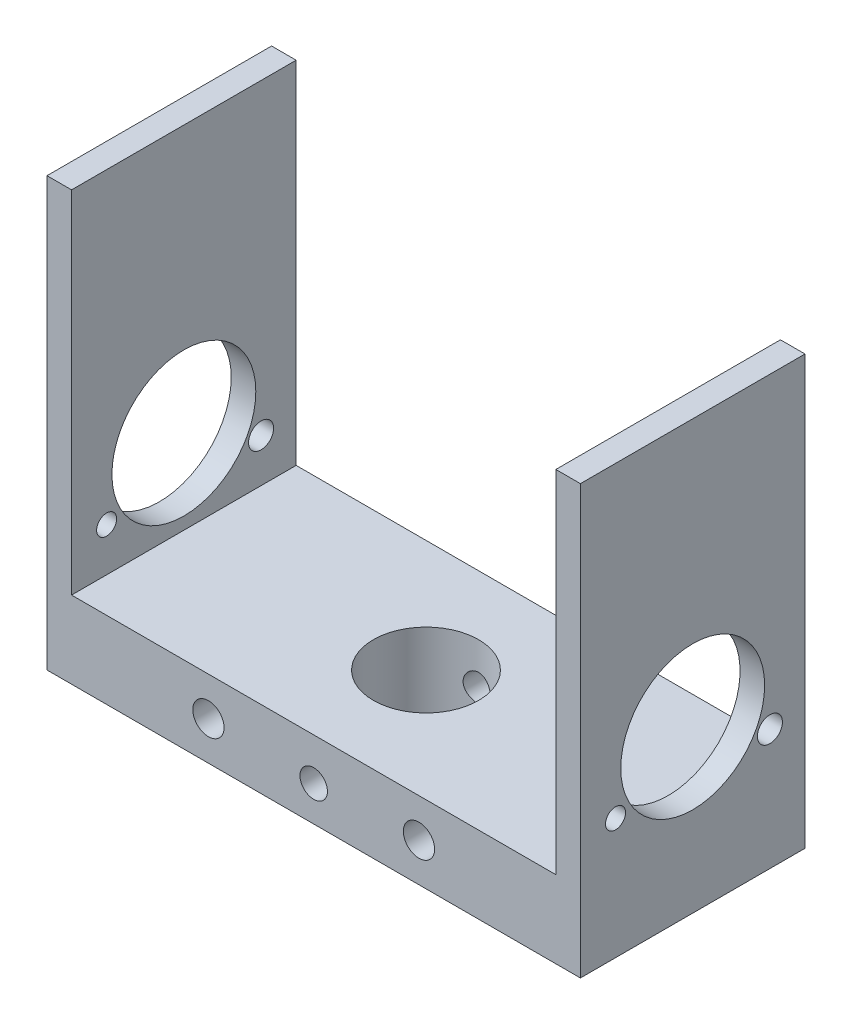
ISO-10303-21;
HEADER;
FILE_DESCRIPTION(('STEP AP214'),'2;1');
FILE_NAME('part.step','',(''),(''),'','','');
FILE_SCHEMA(('AUTOMOTIVE_DESIGN { 1 0 10303 214 1 1 1 1 }'));
ENDSEC;
DATA;
#1=APPLICATION_CONTEXT('core data for automotive mechanical design processes');
#2=APPLICATION_PROTOCOL_DEFINITION('international standard','automotive_design',2000,#1);
#3=PRODUCT_CONTEXT('',#1,'mechanical');
#4=PRODUCT('Part','Part','',(#3));
#5=PRODUCT_RELATED_PRODUCT_CATEGORY('part','',(#4));
#6=PRODUCT_DEFINITION_FORMATION('','',#4);
#7=PRODUCT_DEFINITION_CONTEXT('part definition',#1,'design');
#8=PRODUCT_DEFINITION('design','',#6,#7);
#9=PRODUCT_DEFINITION_SHAPE('','',#8);
#10=(LENGTH_UNIT() NAMED_UNIT(*) SI_UNIT(.MILLI.,.METRE.));
#11=(NAMED_UNIT(*) PLANE_ANGLE_UNIT() SI_UNIT($,.RADIAN.));
#12=(NAMED_UNIT(*) SI_UNIT($,.STERADIAN.) SOLID_ANGLE_UNIT());
#13=UNCERTAINTY_MEASURE_WITH_UNIT(LENGTH_MEASURE(1.E-05),#10,'distance_accuracy_value','');
#14=(GEOMETRIC_REPRESENTATION_CONTEXT(3) GLOBAL_UNCERTAINTY_ASSIGNED_CONTEXT((#13)) GLOBAL_UNIT_ASSIGNED_CONTEXT((#10,
#11,#12)) REPRESENTATION_CONTEXT('',''));
#15=CARTESIAN_POINT('',(0.,0.,0.));
#16=DIRECTION('',(0.,0.,1.));
#17=DIRECTION('',(1.,0.,0.));
#18=AXIS2_PLACEMENT_3D('',#15,#16,#17);
#19=CARTESIAN_POINT('',(0.,11.,0.));
#20=DIRECTION('',(0.,-1.,0.));
#21=DIRECTION('',(0.,0.,-1.));
#22=AXIS2_PLACEMENT_3D('',#19,#20,#21);
#23=CYLINDRICAL_SURFACE('',#22,7.5);
#24=CARTESIAN_POINT('',(0.,6.95657881978151,-7.5));
#25=CARTESIAN_POINT('',(-0.107946364564902,6.95657608479232,-7.49999829409718));
#26=CARTESIAN_POINT('',(-0.215922460247262,6.9476155726121,-7.49764648086753));
#27=CARTESIAN_POINT('',(-0.428769781257654,6.91207024837906,-7.48849284636282));
#28=CARTESIAN_POINT('',(-0.533639389937558,6.88547642243373,-7.48168874916857));
#29=CARTESIAN_POINT('',(-0.737170149926897,6.81558367474133,-7.46438241061037));
#30=CARTESIAN_POINT('',(-0.83583893180239,6.77230577141053,-7.45388482371132));
#31=CARTESIAN_POINT('',(-1.02451713461076,6.67034989228236,-7.43030394518545));
#32=CARTESIAN_POINT('',(-1.11452607759247,6.6116710671476,-7.41722051096291));
#33=CARTESIAN_POINT('',(-1.2853343315649,6.47919892245098,-7.38955744104232));
#34=CARTESIAN_POINT('',(-1.36591327821114,6.40512661698847,-7.37495310192332));
#35=CARTESIAN_POINT('',(-1.51365738047839,6.24456686229889,-7.34605477210242));
#36=CARTESIAN_POINT('',(-1.58082088664746,6.15807788866486,-7.33176081975545));
#37=CARTESIAN_POINT('',(-1.70088852195455,5.97339792459517,-7.30485028951631));
#38=CARTESIAN_POINT('',(-1.75354162313657,5.87503876286007,-7.29226494903625));
#39=CARTESIAN_POINT('',(-1.84147785560564,5.6704830459492,-7.27055877998523));
#40=CARTESIAN_POINT('',(-1.87676403752897,5.56428787100226,-7.26143734301666));
#41=CARTESIAN_POINT('',(-1.92820426186949,5.34950906386497,-7.24794638867982));
#42=CARTESIAN_POINT('',(-1.94475667734311,5.24102719650644,-7.24347809401741));
#43=CARTESIAN_POINT('',(-1.95950110574343,5.02274140821986,-7.23950402851081));
#44=CARTESIAN_POINT('',(-1.95769639064206,4.91293772637659,-7.23999737330463));
#45=CARTESIAN_POINT('',(-1.93609461211739,4.69821456169404,-7.24580230007284));
#46=CARTESIAN_POINT('',(-1.91677697065728,4.59324282802915,-7.25098548877502));
#47=CARTESIAN_POINT('',(-1.86146446333956,4.38808432021206,-7.26538085026939));
#48=CARTESIAN_POINT('',(-1.82546831572267,4.28789791446981,-7.27459333271366));
#49=CARTESIAN_POINT('',(-1.73742363128245,4.09389163729188,-7.29612391025943));
#50=CARTESIAN_POINT('',(-1.6852049322767,4.0001527663405,-7.30847466075432));
#51=CARTESIAN_POINT('',(-1.56631625419894,3.8225983531511,-7.33487229182484));
#52=CARTESIAN_POINT('',(-1.49964354138536,3.73878469274828,-7.3489194930336));
#53=CARTESIAN_POINT('',(-1.35127675636788,3.58071776395202,-7.37766388694415));
#54=CARTESIAN_POINT('',(-1.26917938027748,3.50684374037711,-7.39236769485393));
#55=CARTESIAN_POINT('',(-1.09358279011063,3.3738361993755,-7.42037529647513));
#56=CARTESIAN_POINT('',(-1.00008316422827,3.31470321457402,-7.43367903958919));
#57=CARTESIAN_POINT('',(-0.803765272671003,3.21269924222162,-7.45746365900913));
#58=CARTESIAN_POINT('',(-0.700911155681178,3.16989439085628,-7.46793300612001));
#59=CARTESIAN_POINT('',(-0.489131848650789,3.1022911874673,-7.48478573185381));
#60=CARTESIAN_POINT('',(-0.380207931582816,3.07748907505675,-7.49116996373687));
#61=CARTESIAN_POINT('',(-0.162619612573132,3.04718507907007,-7.49900506988132));
#62=CARTESIAN_POINT('',(-0.0540317016819167,3.04116728875273,-7.50058778155143));
#63=CARTESIAN_POINT('',(0.162600978971437,3.04718147109928,-7.4990193037233));
#64=CARTESIAN_POINT('',(0.270645801233394,3.05921166405311,-7.49586858098859));
#65=CARTESIAN_POINT('',(0.481301170897615,3.10055638216674,-7.48527217694353));
#66=CARTESIAN_POINT('',(0.583971654548013,3.12958538362453,-7.47789748805037));
#67=CARTESIAN_POINT('',(0.782977392824017,3.20377405385957,-7.45968766837723));
#68=CARTESIAN_POINT('',(0.879311975262717,3.24893543089064,-7.44885217114585));
#69=CARTESIAN_POINT('',(1.06493298841419,3.35507895472866,-7.42461127694485));
#70=CARTESIAN_POINT('',(1.15405125163689,3.41634470209864,-7.4111610692043));
#71=CARTESIAN_POINT('',(1.32092387228479,3.55259923612709,-7.38324659525931));
#72=CARTESIAN_POINT('',(1.39867608025108,3.62759061244527,-7.36878213801131));
#73=CARTESIAN_POINT('',(1.5427666331707,3.79157120626935,-7.33998800539096));
#74=CARTESIAN_POINT('',(1.60874168302897,3.88088270113256,-7.32567242227141));
#75=CARTESIAN_POINT('',(1.7247729672489,4.06960936068848,-7.29922689640339));
#76=CARTESIAN_POINT('',(1.77482988555097,4.16902409104207,-7.28709685976016));
#77=CARTESIAN_POINT('',(1.85722734966055,4.37462312714089,-7.26653362065818));
#78=CARTESIAN_POINT('',(1.88967176163885,4.48076352943255,-7.2580788045976));
#79=CARTESIAN_POINT('',(1.93617987745534,4.69724988253897,-7.24581237283704));
#80=CARTESIAN_POINT('',(1.95024803453631,4.80759480776971,-7.24199963220658));
#81=CARTESIAN_POINT('',(1.95935631656429,5.02564665644383,-7.23954013519883));
#82=CARTESIAN_POINT('',(1.95497916242649,5.13332782737795,-7.24073516740981));
#83=CARTESIAN_POINT('',(1.92866638884747,5.34635951265062,-7.24778778271667));
#84=CARTESIAN_POINT('',(1.90673118503415,5.45171008209767,-7.25364525544491));
#85=CARTESIAN_POINT('',(1.84625602033183,5.65639201972108,-7.26927067907943));
#86=CARTESIAN_POINT('',(1.8078345194924,5.75576066914006,-7.27901069767724));
#87=CARTESIAN_POINT('',(1.71556987778395,5.94671522396255,-7.30130553554317));
#88=CARTESIAN_POINT('',(1.66172441447788,6.03829995462069,-7.31386077864708));
#89=CARTESIAN_POINT('',(1.53835279067282,6.21388065722421,-7.34081452826713));
#90=CARTESIAN_POINT('',(1.46842659689182,6.29758913051163,-7.35525508940553));
#91=CARTESIAN_POINT('',(1.31564591249168,6.45227322525811,-7.38411193422154));
#92=CARTESIAN_POINT('',(1.23278831076941,6.52324577378778,-7.39852821121091));
#93=CARTESIAN_POINT('',(1.05447630015724,6.65184920198947,-7.42606026321141));
#94=CARTESIAN_POINT('',(0.958801184743865,6.70918151474524,-7.43914387340147));
#95=CARTESIAN_POINT('',(0.758834470912768,6.80685751890578,-7.46218921477443));
#96=CARTESIAN_POINT('',(0.654548688398568,6.84721256677893,-7.47215303171156));
#97=CARTESIAN_POINT('',(0.4588138485334,6.90426587808921,-7.48648184499085));
#98=CARTESIAN_POINT('',(0.36824102917206,6.92383880503031,-7.49151497124519));
#99=CARTESIAN_POINT('',(0.185119309122388,6.94999586469676,-7.49827463156544));
#100=CARTESIAN_POINT('',(0.0925705868533558,6.95658116520143,-7.50000146291564));
#101=CARTESIAN_POINT('',(0.,6.95657881978151,-7.5));
#102=B_SPLINE_CURVE_WITH_KNOTS('',3,(#24,#25,#26,#27,#28,#29,#30,#31,#32,#33,#34,#35,#36,#37,
#38,#39,#40,#41,#42,#43,#44,#45,#46,#47,#48,#49,#50,#51,#52,#53,#54,#55,#56,#57,#58,#59,#60,#61,
#62,#63,#64,#65,#66,#67,#68,#69,#70,#71,#72,#73,#74,#75,#76,#77,#78,#79,#80,#81,#82,#83,#84,#85,
#86,#87,#88,#89,#90,#91,#92,#93,#94,#95,#96,#97,#98,#99,#100,#101),.UNSPECIFIED.,.T.,.F.,(4,2,2,
2,2,2,2,2,2,2,2,2,2,2,2,2,2,2,2,2,2,2,2,2,2,2,2,2,2,2,2,2,2,2,2,2,2,2,4),(0.,0.32349970030434,
0.647164896553866,0.970423668447146,1.29370027131695,1.62344664876618,1.9532335441881,
2.28841110907767,2.62352977635381,2.9513797663814,3.27917132150473,3.59825180225162,
3.9173568087096,4.23992893818654,4.56256213024292,4.89524779778665,5.22794548423242,
5.56197678570706,5.89593829509701,6.22064309380061,6.54531587549663,6.86468560314075,
7.18408915880735,7.50954574099367,7.83506379156495,8.16933827570965,8.50359839543439,
8.8358652569697,9.16805158306996,9.48982352718205,9.81158785464847,10.1310779172683,
10.4506161118741,10.7791819085228,11.1078268753861,11.4431126109362,11.7781737084425,
12.0556193660821,12.3330400761242),.UNSPECIFIED.);
#103=CARTESIAN_POINT('',(0.,6.95657881978151,-7.5));
#104=VERTEX_POINT('',#103);
#105=EDGE_CURVE('E231',#104,#104,#102,.T.);
#106=ORIENTED_EDGE('',*,*,#105,.F.);
#107=EDGE_LOOP('',(#106));
#108=FACE_BOUND('',#107,.T.);
#109=CARTESIAN_POINT('',(1.95657881978151,5.,7.24029000261608));
#110=CARTESIAN_POINT('',(1.9565760467599,4.89212413071801,7.24029195002129));
#111=CARTESIAN_POINT('',(1.94762683085069,4.78421845460437,7.24272727499572));
#112=CARTESIAN_POINT('',(1.91213043552985,4.57151718314405,7.25217782412518));
#113=CARTESIAN_POINT('',(1.88557393036292,4.46672326669808,7.25919547529363));
#114=CARTESIAN_POINT('',(1.81579023358658,4.26335309083301,7.27696300468709));
#115=CARTESIAN_POINT('',(1.77258579947214,4.1647685563857,7.28770778598318));
#116=CARTESIAN_POINT('',(1.67080327315547,3.97623321682641,7.31171246602871));
#117=CARTESIAN_POINT('',(1.61222417628182,3.88628297645509,7.32497252912585));
#118=CARTESIAN_POINT('',(1.47985579460554,3.71541565210849,7.35286937756008));
#119=CARTESIAN_POINT('',(1.40576506142926,3.63473589503927,7.36752972863036));
#120=CARTESIAN_POINT('',(1.24512523624676,3.4867951817206,7.39637153864115));
#121=CARTESIAN_POINT('',(1.15857490008447,3.41953556714432,7.41055294958221));
#122=CARTESIAN_POINT('',(0.973834063729922,3.2993613554589,7.43710119473916));
#123=CARTESIAN_POINT('',(0.875485878480729,3.24668171037913,7.44943698342588));
#124=CARTESIAN_POINT('',(0.670953593091338,3.15869345877179,7.47063422849569));
#125=CARTESIAN_POINT('',(0.56477075863742,3.12338205344322,7.47949624461231));
#126=CARTESIAN_POINT('',(0.350059462872555,3.07189793094571,7.49258081685298));
#127=CARTESIAN_POINT('',(0.241633801783191,3.05532174488583,7.49690103309964));
#128=CARTESIAN_POINT('',(0.0234602745278105,3.04051024591311,7.50075628840478));
#129=CARTESIAN_POINT('',(-0.0862873766617317,3.0422719901294,7.50029209526534));
#130=CARTESIAN_POINT('',(-0.301184798892924,3.06380007066374,7.4947027939177));
#131=CARTESIAN_POINT('',(-0.406381604209235,3.08313063988602,7.48969049907903));
#132=CARTESIAN_POINT('',(-0.61198328750698,3.13854490876596,7.47570067353581));
#133=CARTESIAN_POINT('',(-0.712387897998652,3.17462954239538,7.46672292177432));
#134=CARTESIAN_POINT('',(-0.906680101121759,3.26286816169961,7.44564174227417));
#135=CARTESIAN_POINT('',(-1.00049565612321,3.31517348979272,7.4335090581886));
#136=CARTESIAN_POINT('',(-1.17816793360541,3.43425307209012,7.40742841116101));
#137=CARTESIAN_POINT('',(-1.262022783213,3.50103004069564,7.39348010786514));
#138=CARTESIAN_POINT('',(-1.41999367676426,3.6494787448962,7.36479871014674));
#139=CARTESIAN_POINT('',(-1.49375070866784,3.73153082457031,7.35005459973058));
#140=CARTESIAN_POINT('',(-1.62654275435405,3.90699264225742,7.32181538023317));
#141=CARTESIAN_POINT('',(-1.68557694824016,4.00040301236875,7.30832034073744));
#142=CARTESIAN_POINT('',(-1.78750529489173,4.1966819047194,7.28406465859911));
#143=CARTESIAN_POINT('',(-1.83030584158423,4.29960114863421,7.27331998718862));
#144=CARTESIAN_POINT('',(-1.89788128115233,4.51152396597994,7.25598215742412));
#145=CARTESIAN_POINT('',(-1.9226604246375,4.62052609813826,7.24938802015579));
#146=CARTESIAN_POINT('',(-1.95287902837789,4.83817289445563,7.24130533936227));
#147=CARTESIAN_POINT('',(-1.95885235832449,4.94673828691799,7.23967589967451));
#148=CARTESIAN_POINT('',(-1.95275738428679,5.16331594540964,7.24132231251562));
#149=CARTESIAN_POINT('',(-1.94069090732536,5.27132826634086,7.24459766830012));
#150=CARTESIAN_POINT('',(-1.89932860944024,5.48170329455611,7.25554890491929));
#151=CARTESIAN_POINT('',(-1.87035012022524,5.58413302352422,7.26314367247139));
#152=CARTESIAN_POINT('',(-1.79634142802857,5.78267925435925,7.28179954164596));
#153=CARTESIAN_POINT('',(-1.7513091963576,5.87879495651255,7.29286108133828));
#154=CARTESIAN_POINT('',(-1.64537562838137,6.0642284445644,7.31749596530793));
#155=CARTESIAN_POINT('',(-1.58415877483339,6.15335943678191,7.33111749051056));
#156=CARTESIAN_POINT('',(-1.44798755293721,6.3202798579526,7.35922248668412));
#157=CARTESIAN_POINT('',(-1.37303071732127,6.39806724544019,7.37370611214514));
#158=CARTESIAN_POINT('',(-1.20904468818024,6.54228952161133,7.40238575827651));
#159=CARTESIAN_POINT('',(-1.119685045065,6.60835316068968,7.41656290067498));
#160=CARTESIAN_POINT('',(-0.930833000319286,6.72454024563542,7.44262199451497));
#161=CARTESIAN_POINT('',(-0.831341136460114,6.77466453690797,7.45450406767125));
#162=CARTESIAN_POINT('',(-0.625746885220538,6.85709783834595,7.47455803493956));
#163=CARTESIAN_POINT('',(-0.519700059304669,6.88953845614815,7.48275725520746));
#164=CARTESIAN_POINT('',(-0.303415521073824,6.93607044386859,7.49464174290238));
#165=CARTESIAN_POINT('',(-0.193178699794328,6.95016569285226,7.49832796457771));
#166=CARTESIAN_POINT('',(0.0248815153029545,6.95937253888212,7.50072821515586));
#167=CARTESIAN_POINT('',(0.132680628557199,6.955029853343,7.49958518304849));
#168=CARTESIAN_POINT('',(0.3459576345052,6.92874513051712,7.4927763858792));
#169=CARTESIAN_POINT('',(0.451435607631854,6.90680370405742,7.48711077778943));
#170=CARTESIAN_POINT('',(0.656449830748895,6.84624745278508,7.47191961010743));
#171=CARTESIAN_POINT('',(0.756019482453151,6.80773911229083,7.46241872552805));
#172=CARTESIAN_POINT('',(0.947341202240294,6.71523762493197,7.44055287020435));
#173=CARTESIAN_POINT('',(1.03909220925047,6.66124238065808,7.42818751156464));
#174=CARTESIAN_POINT('',(1.21472964026835,6.53767887781265,7.40152228311667));
#175=CARTESIAN_POINT('',(1.29835306905931,6.4677457766101,7.38718083520358));
#176=CARTESIAN_POINT('',(1.45286253786331,6.3149894601169,7.35835451253555));
#177=CARTESIAN_POINT('',(1.52374526609145,6.23216290374508,7.34386960151858));
#178=CARTESIAN_POINT('',(1.65221610406082,6.05389859303383,7.31605098681558));
#179=CARTESIAN_POINT('',(1.70949717335069,5.95823444694526,7.30274747833311));
#180=CARTESIAN_POINT('',(1.80708014056154,5.75829889893107,7.27921686018942));
#181=CARTESIAN_POINT('',(1.84739359244492,5.65403341206856,7.26898765846534));
#182=CARTESIAN_POINT('',(1.90436115337269,5.45839892984815,7.25424785922683));
#183=CARTESIAN_POINT('',(1.923897990956,5.36791037178969,7.24905494513987));
#184=CARTESIAN_POINT('',(1.95000734425522,5.18495504245502,7.24207535769968));
#185=CARTESIAN_POINT('',(1.95658119725985,5.09248847622926,7.24028833298838));
#186=CARTESIAN_POINT('',(1.95657881978151,5.,7.24029000261608));
#187=B_SPLINE_CURVE_WITH_KNOTS('',3,(#109,#110,#111,#112,#113,#114,#115,#116,#117,#118,#119,
#120,#121,#122,#123,#124,#125,#126,#127,#128,#129,#130,#131,#132,#133,#134,#135,#136,#137,#138,
#139,#140,#141,#142,#143,#144,#145,#146,#147,#148,#149,#150,#151,#152,#153,#154,#155,#156,#157,
#158,#159,#160,#161,#162,#163,#164,#165,#166,#167,#168,#169,#170,#171,#172,#173,#174,#175,#176,
#177,#178,#179,#180,#181,#182,#183,#184,#185,#186),.UNSPECIFIED.,.T.,.F.,(4,2,2,2,2,2,2,2,2,2,2,
2,2,2,2,2,2,2,2,2,2,2,2,2,2,2,2,2,2,2,2,2,2,2,2,2,2,2,4),(0.,0.323287675067626,
0.646746717388834,0.969765155240466,1.29280470628571,1.62282800064198,1.9528842724263,
2.28798494098383,2.62303159211525,2.95071658148417,3.27834898478019,3.59807035675297,
3.91780955404773,4.24062661145748,4.56350427115898,4.89587916408412,5.22827256242208,
5.5625544704317,5.89675750760752,6.22138325836327,6.54597613412769,6.86466581492834,
7.18339578238821,7.50886756450807,7.83439784845749,8.16888498773925,8.50335438323774,
8.83529932939428,9.1671740755194,9.48929569981457,9.81140614421389,10.1314764411435,
10.4515901060478,10.7799376836061,11.1083704879468,11.443631574276,11.7786639964701,
12.0558665786222,12.3330405624772),.UNSPECIFIED.);
#188=CARTESIAN_POINT('',(1.95657881978151,5.,7.24029000261608));
#189=VERTEX_POINT('',#188);
#190=EDGE_CURVE('E235',#189,#189,#187,.T.);
#191=ORIENTED_EDGE('',*,*,#190,.F.);
#192=EDGE_LOOP('',(#191));
#193=FACE_BOUND('',#192,.T.);
#194=CARTESIAN_POINT('',(0.,0.,0.));
#195=DIRECTION('',(0.,1.,0.));
#196=DIRECTION('',(0.,0.,1.));
#197=AXIS2_PLACEMENT_3D('',#194,#195,#196);
#198=CIRCLE('',#197,7.5);
#199=CARTESIAN_POINT('',(0.,0.,7.5));
#200=VERTEX_POINT('',#199);
#201=EDGE_CURVE('E180',#200,#200,#198,.T.);
#202=ORIENTED_EDGE('',*,*,#201,.F.);
#203=EDGE_LOOP('',(#202));
#204=FACE_BOUND('',#203,.T.);
#205=CARTESIAN_POINT('',(0.,11.,0.));
#206=DIRECTION('',(0.,1.,0.));
#207=DIRECTION('',(0.,0.,1.));
#208=AXIS2_PLACEMENT_3D('',#205,#206,#207);
#209=CIRCLE('',#208,7.5);
#210=CARTESIAN_POINT('',(0.,11.,7.5));
#211=VERTEX_POINT('',#210);
#212=EDGE_CURVE('E181',#211,#211,#209,.T.);
#213=ORIENTED_EDGE('',*,*,#212,.T.);
#214=EDGE_LOOP('',(#213));
#215=FACE_BOUND('',#214,.T.);
#216=ADVANCED_FACE('F35',(#108,#193,#204,#215),#23,.F.);
#217=CARTESIAN_POINT('',(0.,11.,16.));
#218=DIRECTION('',(0.,0.,-1.));
#219=DIRECTION('',(-1.,0.,0.));
#220=AXIS2_PLACEMENT_3D('',#217,#218,#219);
#221=PLANE('',#220);
#222=CARTESIAN_POINT('',(0.,5.,16.));
#223=DIRECTION('',(0.,0.,1.));
#224=DIRECTION('',(1.,0.,0.));
#225=AXIS2_PLACEMENT_3D('',#222,#223,#224);
#226=CIRCLE('',#225,1.95657881978151);
#227=CARTESIAN_POINT('',(1.95657881978151,5.,16.));
#228=VERTEX_POINT('',#227);
#229=EDGE_CURVE('E369',#228,#228,#226,.T.);
#230=ORIENTED_EDGE('',*,*,#229,.F.);
#231=EDGE_LOOP('',(#230));
#232=FACE_BOUND('',#231,.T.);
#233=CARTESIAN_POINT('',(-15.,5.5,16.));
#234=DIRECTION('',(0.,0.,-1.));
#235=DIRECTION('',(-1.,0.,0.));
#236=AXIS2_PLACEMENT_3D('',#233,#234,#235);
#237=CIRCLE('',#236,2.22645949007591);
#238=CARTESIAN_POINT('',(-17.2264594900759,5.5,16.));
#239=VERTEX_POINT('',#238);
#240=EDGE_CURVE('E325',#239,#239,#237,.F.);
#241=ORIENTED_EDGE('',*,*,#240,.F.);
#242=EDGE_LOOP('',(#241));
#243=FACE_BOUND('',#242,.T.);
#244=CARTESIAN_POINT('',(15.,5.5,16.));
#245=DIRECTION('',(0.,0.,-1.));
#246=DIRECTION('',(-1.,0.,0.));
#247=AXIS2_PLACEMENT_3D('',#244,#245,#246);
#248=CIRCLE('',#247,2.22645949007591);
#249=CARTESIAN_POINT('',(12.7735405099241,5.5,16.));
#250=VERTEX_POINT('',#249);
#251=EDGE_CURVE('E140',#250,#250,#248,.T.);
#252=ORIENTED_EDGE('',*,*,#251,.T.);
#253=EDGE_LOOP('',(#252));
#254=FACE_BOUND('',#253,.T.);
#255=DIRECTION('',(1.,0.,0.));
#256=VECTOR('',#255,1.);
#257=CARTESIAN_POINT('',(0.,0.,16.));
#258=LINE('',#257,#256);
#259=CARTESIAN_POINT('',(-38.,0.,16.));
#260=VERTEX_POINT('',#259);
#261=CARTESIAN_POINT('',(38.,0.,16.));
#262=VERTEX_POINT('',#261);
#263=EDGE_CURVE('E190',#260,#262,#258,.T.);
#264=ORIENTED_EDGE('',*,*,#263,.T.);
#265=DIRECTION('',(0.,-1.,0.));
#266=VECTOR('',#265,1.);
#267=CARTESIAN_POINT('',(38.,11.,16.));
#268=LINE('',#267,#266);
#269=CARTESIAN_POINT('',(38.,61.,16.));
#270=VERTEX_POINT('',#269);
#271=EDGE_CURVE('E11',#270,#262,#268,.T.);
#272=ORIENTED_EDGE('',*,*,#271,.F.);
#273=DIRECTION('',(1.,0.,0.));
#274=VECTOR('',#273,1.);
#275=CARTESIAN_POINT('',(38.,61.,16.));
#276=LINE('',#275,#274);
#277=CARTESIAN_POINT('',(34.5,61.,16.));
#278=VERTEX_POINT('',#277);
#279=EDGE_CURVE('E169',#278,#270,#276,.T.);
#280=ORIENTED_EDGE('',*,*,#279,.F.);
#281=DIRECTION('',(0.,-1.,0.));
#282=VECTOR('',#281,1.);
#283=CARTESIAN_POINT('',(34.5,61.,16.));
#284=LINE('',#283,#282);
#285=CARTESIAN_POINT('',(34.5,11.,16.));
#286=VERTEX_POINT('',#285);
#287=EDGE_CURVE('E172',#278,#286,#284,.T.);
#288=ORIENTED_EDGE('',*,*,#287,.T.);
#289=DIRECTION('',(1.,0.,0.));
#290=VECTOR('',#289,1.);
#291=CARTESIAN_POINT('',(0.,11.,16.));
#292=LINE('',#291,#290);
#293=CARTESIAN_POINT('',(-34.5,11.,16.));
#294=VERTEX_POINT('',#293);
#295=EDGE_CURVE('E184',#294,#286,#292,.T.);
#296=ORIENTED_EDGE('',*,*,#295,.F.);
#297=DIRECTION('',(0.,-1.,0.));
#298=VECTOR('',#297,1.);
#299=CARTESIAN_POINT('',(-34.5,61.,16.));
#300=LINE('',#299,#298);
#301=CARTESIAN_POINT('',(-34.5,61.,16.));
#302=VERTEX_POINT('',#301);
#303=EDGE_CURVE('E123',#302,#294,#300,.T.);
#304=ORIENTED_EDGE('',*,*,#303,.F.);
#305=DIRECTION('',(-1.,0.,0.));
#306=VECTOR('',#305,1.);
#307=CARTESIAN_POINT('',(-38.,61.,16.));
#308=LINE('',#307,#306);
#309=CARTESIAN_POINT('',(-38.,61.,16.));
#310=VERTEX_POINT('',#309);
#311=EDGE_CURVE('E116',#302,#310,#308,.T.);
#312=ORIENTED_EDGE('',*,*,#311,.T.);
#313=DIRECTION('',(0.,-1.,0.));
#314=VECTOR('',#313,1.);
#315=CARTESIAN_POINT('',(-38.,11.,16.));
#316=LINE('',#315,#314);
#317=EDGE_CURVE('E99',#310,#260,#316,.T.);
#318=ORIENTED_EDGE('',*,*,#317,.T.);
#319=EDGE_LOOP('',(#264,#272,#280,#288,#296,#304,#312,#318));
#320=FACE_BOUND('',#319,.T.);
#321=ADVANCED_FACE('F121',(#232,#243,#254,#320),#221,.F.);
#322=CARTESIAN_POINT('',(38.,11.,0.));
#323=DIRECTION('',(1.,0.,0.));
#324=DIRECTION('',(0.,0.,-1.));
#325=AXIS2_PLACEMENT_3D('',#322,#323,#324);
#326=PLANE('',#325);
#327=CARTESIAN_POINT('',(38.,17.2028115427221,11.));
#328=DIRECTION('',(1.,0.,0.));
#329=DIRECTION('',(0.,0.,-1.));
#330=AXIS2_PLACEMENT_3D('',#327,#328,#329);
#331=CIRCLE('',#330,1.42619686923485);
#332=CARTESIAN_POINT('',(38.,17.2028115427221,9.57380313076514));
#333=VERTEX_POINT('',#332);
#334=EDGE_CURVE('E158',#333,#333,#331,.T.);
#335=ORIENTED_EDGE('',*,*,#334,.F.);
#336=EDGE_LOOP('',(#335));
#337=FACE_BOUND('',#336,.T.);
#338=CARTESIAN_POINT('',(38.,17.2028115427221,-11.));
#339=DIRECTION('',(1.,0.,0.));
#340=DIRECTION('',(0.,0.,-1.));
#341=AXIS2_PLACEMENT_3D('',#338,#339,#340);
#342=CIRCLE('',#341,1.78360949148613);
#343=CARTESIAN_POINT('',(38.,17.2028115427221,-12.7836094914861));
#344=VERTEX_POINT('',#343);
#345=EDGE_CURVE('E155',#344,#344,#342,.T.);
#346=ORIENTED_EDGE('',*,*,#345,.F.);
#347=EDGE_LOOP('',(#346));
#348=FACE_BOUND('',#347,.T.);
#349=CARTESIAN_POINT('',(38.,23.,0.));
#350=DIRECTION('',(1.,0.,0.));
#351=DIRECTION('',(0.,0.,-1.));
#352=AXIS2_PLACEMENT_3D('',#349,#350,#351);
#353=CIRCLE('',#352,10.25);
#354=CARTESIAN_POINT('',(38.,23.,-10.25));
#355=VERTEX_POINT('',#354);
#356=EDGE_CURVE('E152',#355,#355,#353,.T.);
#357=ORIENTED_EDGE('',*,*,#356,.F.);
#358=EDGE_LOOP('',(#357));
#359=FACE_BOUND('',#358,.T.);
#360=DIRECTION('',(0.,0.,1.));
#361=VECTOR('',#360,1.);
#362=CARTESIAN_POINT('',(38.,0.,0.));
#363=LINE('',#362,#361);
#364=CARTESIAN_POINT('',(38.,0.,-16.));
#365=VERTEX_POINT('',#364);
#366=EDGE_CURVE('E192',#365,#262,#363,.T.);
#367=ORIENTED_EDGE('',*,*,#366,.F.);
#368=DIRECTION('',(0.,-1.,0.));
#369=VECTOR('',#368,1.);
#370=CARTESIAN_POINT('',(38.,11.,-16.));
#371=LINE('',#370,#369);
#372=CARTESIAN_POINT('',(38.,61.,-16.));
#373=VERTEX_POINT('',#372);
#374=EDGE_CURVE('E43',#373,#365,#371,.T.);
#375=ORIENTED_EDGE('',*,*,#374,.F.);
#376=DIRECTION('',(0.,0.,-1.));
#377=VECTOR('',#376,1.);
#378=CARTESIAN_POINT('',(38.,61.,-16.));
#379=LINE('',#378,#377);
#380=EDGE_CURVE('E162',#270,#373,#379,.T.);
#381=ORIENTED_EDGE('',*,*,#380,.F.);
#382=ORIENTED_EDGE('',*,*,#271,.T.);
#383=EDGE_LOOP('',(#367,#375,#381,#382));
#384=FACE_BOUND('',#383,.T.);
#385=ADVANCED_FACE('F203',(#337,#348,#359,#384),#326,.T.);
#386=CARTESIAN_POINT('',(0.,11.,-16.));
#387=DIRECTION('',(0.,0.,-1.));
#388=DIRECTION('',(-1.,0.,0.));
#389=AXIS2_PLACEMENT_3D('',#386,#387,#388);
#390=PLANE('',#389);
#391=CARTESIAN_POINT('',(0.,5.,-16.));
#392=DIRECTION('',(0.,0.,1.));
#393=DIRECTION('',(1.,0.,0.));
#394=AXIS2_PLACEMENT_3D('',#391,#392,#393);
#395=CIRCLE('',#394,1.95657881978151);
#396=CARTESIAN_POINT('',(1.95657881978151,5.,-16.));
#397=VERTEX_POINT('',#396);
#398=EDGE_CURVE('E367',#397,#397,#395,.T.);
#399=ORIENTED_EDGE('',*,*,#398,.T.);
#400=EDGE_LOOP('',(#399));
#401=FACE_BOUND('',#400,.T.);
#402=CARTESIAN_POINT('',(-15.,5.5,-16.));
#403=DIRECTION('',(0.,0.,1.));
#404=DIRECTION('',(1.,0.,0.));
#405=AXIS2_PLACEMENT_3D('',#402,#403,#404);
#406=CIRCLE('',#405,2.22645949007591);
#407=CARTESIAN_POINT('',(-12.7735405099241,5.5,-16.));
#408=VERTEX_POINT('',#407);
#409=EDGE_CURVE('E322',#408,#408,#406,.T.);
#410=ORIENTED_EDGE('',*,*,#409,.T.);
#411=EDGE_LOOP('',(#410));
#412=FACE_BOUND('',#411,.T.);
#413=CARTESIAN_POINT('',(15.,5.5,-16.));
#414=DIRECTION('',(0.,0.,-1.));
#415=DIRECTION('',(-1.,0.,0.));
#416=AXIS2_PLACEMENT_3D('',#413,#414,#415);
#417=CIRCLE('',#416,2.22645949007591);
#418=CARTESIAN_POINT('',(12.7735405099241,5.5,-16.));
#419=VERTEX_POINT('',#418);
#420=EDGE_CURVE('E137',#419,#419,#417,.T.);
#421=ORIENTED_EDGE('',*,*,#420,.F.);
#422=EDGE_LOOP('',(#421));
#423=FACE_BOUND('',#422,.T.);
#424=DIRECTION('',(1.,0.,0.));
#425=VECTOR('',#424,1.);
#426=CARTESIAN_POINT('',(0.,0.,-16.));
#427=LINE('',#426,#425);
#428=CARTESIAN_POINT('',(-38.,0.,-16.));
#429=VERTEX_POINT('',#428);
#430=EDGE_CURVE('E185',#429,#365,#427,.T.);
#431=ORIENTED_EDGE('',*,*,#430,.F.);
#432=DIRECTION('',(0.,-1.,0.));
#433=VECTOR('',#432,1.);
#434=CARTESIAN_POINT('',(-38.,11.,-16.));
#435=LINE('',#434,#433);
#436=CARTESIAN_POINT('',(-38.,61.,-16.));
#437=VERTEX_POINT('',#436);
#438=EDGE_CURVE('E110',#437,#429,#435,.T.);
#439=ORIENTED_EDGE('',*,*,#438,.F.);
#440=DIRECTION('',(1.,0.,0.));
#441=VECTOR('',#440,1.);
#442=CARTESIAN_POINT('',(-38.,61.,-16.));
#443=LINE('',#442,#441);
#444=CARTESIAN_POINT('',(-34.5,61.,-16.));
#445=VERTEX_POINT('',#444);
#446=EDGE_CURVE('E119',#437,#445,#443,.T.);
#447=ORIENTED_EDGE('',*,*,#446,.T.);
#448=DIRECTION('',(0.,-1.,0.));
#449=VECTOR('',#448,1.);
#450=CARTESIAN_POINT('',(-34.5,61.,-16.));
#451=LINE('',#450,#449);
#452=CARTESIAN_POINT('',(-34.5,11.,-16.));
#453=VERTEX_POINT('',#452);
#454=EDGE_CURVE('E130',#445,#453,#451,.T.);
#455=ORIENTED_EDGE('',*,*,#454,.T.);
#456=DIRECTION('',(1.,0.,0.));
#457=VECTOR('',#456,1.);
#458=CARTESIAN_POINT('',(0.,11.,-16.));
#459=LINE('',#458,#457);
#460=CARTESIAN_POINT('',(34.5,11.,-16.));
#461=VERTEX_POINT('',#460);
#462=EDGE_CURVE('E55',#453,#461,#459,.T.);
#463=ORIENTED_EDGE('',*,*,#462,.T.);
#464=DIRECTION('',(0.,-1.,0.));
#465=VECTOR('',#464,1.);
#466=CARTESIAN_POINT('',(34.5,61.,-16.));
#467=LINE('',#466,#465);
#468=CARTESIAN_POINT('',(34.5,61.,-16.));
#469=VERTEX_POINT('',#468);
#470=EDGE_CURVE('E177',#469,#461,#467,.T.);
#471=ORIENTED_EDGE('',*,*,#470,.F.);
#472=DIRECTION('',(-1.,0.,0.));
#473=VECTOR('',#472,1.);
#474=CARTESIAN_POINT('',(38.,61.,-16.));
#475=LINE('',#474,#473);
#476=EDGE_CURVE('E165',#373,#469,#475,.T.);
#477=ORIENTED_EDGE('',*,*,#476,.F.);
#478=ORIENTED_EDGE('',*,*,#374,.T.);
#479=EDGE_LOOP('',(#431,#439,#447,#455,#463,#471,#477,#478));
#480=FACE_BOUND('',#479,.T.);
#481=ADVANCED_FACE('F199',(#401,#412,#423,#480),#390,.T.);
#482=CARTESIAN_POINT('',(0.,11.,0.));
#483=DIRECTION('',(0.,1.,0.));
#484=DIRECTION('',(0.,0.,1.));
#485=AXIS2_PLACEMENT_3D('',#482,#483,#484);
#486=PLANE('',#485);
#487=DIRECTION('',(0.,0.,1.));
#488=VECTOR('',#487,1.);
#489=CARTESIAN_POINT('',(-34.5,11.,-16.));
#490=LINE('',#489,#488);
#491=EDGE_CURVE('E50',#453,#294,#490,.T.);
#492=ORIENTED_EDGE('',*,*,#491,.T.);
#493=ORIENTED_EDGE('',*,*,#295,.T.);
#494=DIRECTION('',(0.,0.,1.));
#495=VECTOR('',#494,1.);
#496=CARTESIAN_POINT('',(34.5,11.,-16.));
#497=LINE('',#496,#495);
#498=EDGE_CURVE('E161',#461,#286,#497,.T.);
#499=ORIENTED_EDGE('',*,*,#498,.F.);
#500=ORIENTED_EDGE('',*,*,#462,.F.);
#501=EDGE_LOOP('',(#492,#493,#499,#500));
#502=FACE_BOUND('',#501,.T.);
#503=ORIENTED_EDGE('',*,*,#212,.F.);
#504=EDGE_LOOP('',(#503));
#505=FACE_BOUND('',#504,.T.);
#506=ADVANCED_FACE('F215',(#502,#505),#486,.T.);
#507=CARTESIAN_POINT('',(0.,0.,0.));
#508=DIRECTION('',(0.,1.,0.));
#509=DIRECTION('',(0.,0.,1.));
#510=AXIS2_PLACEMENT_3D('',#507,#508,#509);
#511=PLANE('',#510);
#512=ORIENTED_EDGE('',*,*,#201,.T.);
#513=EDGE_LOOP('',(#512));
#514=FACE_BOUND('',#513,.T.);
#515=DIRECTION('',(0.,0.,1.));
#516=VECTOR('',#515,1.);
#517=CARTESIAN_POINT('',(-38.,0.,0.));
#518=LINE('',#517,#516);
#519=EDGE_CURVE('E106',#429,#260,#518,.T.);
#520=ORIENTED_EDGE('',*,*,#519,.F.);
#521=ORIENTED_EDGE('',*,*,#430,.T.);
#522=ORIENTED_EDGE('',*,*,#366,.T.);
#523=ORIENTED_EDGE('',*,*,#263,.F.);
#524=EDGE_LOOP('',(#520,#521,#522,#523));
#525=FACE_BOUND('',#524,.T.);
#526=ADVANCED_FACE('F205',(#514,#525),#511,.F.);
#527=CARTESIAN_POINT('',(34.5,61.,-16.));
#528=DIRECTION('',(1.,0.,0.));
#529=DIRECTION('',(0.,0.,-1.));
#530=AXIS2_PLACEMENT_3D('',#527,#528,#529);
#531=PLANE('',#530);
#532=CARTESIAN_POINT('',(34.5,17.2028115427221,11.));
#533=DIRECTION('',(-1.,0.,0.));
#534=DIRECTION('',(0.,0.,1.));
#535=AXIS2_PLACEMENT_3D('',#532,#533,#534);
#536=CIRCLE('',#535,1.42619686923485);
#537=CARTESIAN_POINT('',(34.5,17.2028115427221,12.4261968692348));
#538=VERTEX_POINT('',#537);
#539=EDGE_CURVE('E143',#538,#538,#536,.T.);
#540=ORIENTED_EDGE('',*,*,#539,.F.);
#541=EDGE_LOOP('',(#540));
#542=FACE_BOUND('',#541,.T.);
#543=CARTESIAN_POINT('',(34.5,17.2028115427221,-11.));
#544=DIRECTION('',(-1.,0.,0.));
#545=DIRECTION('',(0.,0.,1.));
#546=AXIS2_PLACEMENT_3D('',#543,#544,#545);
#547=CIRCLE('',#546,1.78360949148613);
#548=CARTESIAN_POINT('',(34.5,17.2028115427221,-9.21639050851388));
#549=VERTEX_POINT('',#548);
#550=EDGE_CURVE('E144',#549,#549,#547,.T.);
#551=ORIENTED_EDGE('',*,*,#550,.F.);
#552=EDGE_LOOP('',(#551));
#553=FACE_BOUND('',#552,.T.);
#554=CARTESIAN_POINT('',(34.5,23.,0.));
#555=DIRECTION('',(-1.,0.,0.));
#556=DIRECTION('',(0.,0.,1.));
#557=AXIS2_PLACEMENT_3D('',#554,#555,#556);
#558=CIRCLE('',#557,10.25);
#559=CARTESIAN_POINT('',(34.5,23.,10.25));
#560=VERTEX_POINT('',#559);
#561=EDGE_CURVE('E147',#560,#560,#558,.T.);
#562=ORIENTED_EDGE('',*,*,#561,.F.);
#563=EDGE_LOOP('',(#562));
#564=FACE_BOUND('',#563,.T.);
#565=ORIENTED_EDGE('',*,*,#498,.T.);
#566=ORIENTED_EDGE('',*,*,#287,.F.);
#567=DIRECTION('',(0.,0.,1.));
#568=VECTOR('',#567,1.);
#569=CARTESIAN_POINT('',(34.5,61.,-16.));
#570=LINE('',#569,#568);
#571=EDGE_CURVE('E167',#469,#278,#570,.T.);
#572=ORIENTED_EDGE('',*,*,#571,.F.);
#573=ORIENTED_EDGE('',*,*,#470,.T.);
#574=EDGE_LOOP('',(#565,#566,#572,#573));
#575=FACE_BOUND('',#574,.T.);
#576=ADVANCED_FACE('F212',(#542,#553,#564,#575),#531,.F.);
#577=CARTESIAN_POINT('',(0.,61.,0.));
#578=DIRECTION('',(0.,-1.,0.));
#579=DIRECTION('',(0.,0.,-1.));
#580=AXIS2_PLACEMENT_3D('',#577,#578,#579);
#581=PLANE('',#580);
#582=ORIENTED_EDGE('',*,*,#380,.T.);
#583=ORIENTED_EDGE('',*,*,#476,.T.);
#584=ORIENTED_EDGE('',*,*,#571,.T.);
#585=ORIENTED_EDGE('',*,*,#279,.T.);
#586=EDGE_LOOP('',(#582,#583,#584,#585));
#587=FACE_BOUND('',#586,.T.);
#588=ADVANCED_FACE('F208',(#587),#581,.F.);
#589=CARTESIAN_POINT('',(84.5,23.,0.));
#590=DIRECTION('',(-1.,0.,0.));
#591=DIRECTION('',(0.,0.,1.));
#592=AXIS2_PLACEMENT_3D('',#589,#590,#591);
#593=CYLINDRICAL_SURFACE('',#592,10.25);
#594=ORIENTED_EDGE('',*,*,#356,.T.);
#595=EDGE_LOOP('',(#594));
#596=FACE_BOUND('',#595,.T.);
#597=ORIENTED_EDGE('',*,*,#561,.T.);
#598=EDGE_LOOP('',(#597));
#599=FACE_BOUND('',#598,.T.);
#600=ADVANCED_FACE('F260',(#596,#599),#593,.F.);
#601=CARTESIAN_POINT('',(84.5,17.2028115427221,-11.));
#602=DIRECTION('',(-1.,0.,0.));
#603=DIRECTION('',(0.,0.,1.));
#604=AXIS2_PLACEMENT_3D('',#601,#602,#603);
#605=CYLINDRICAL_SURFACE('',#604,1.78360949148613);
#606=ORIENTED_EDGE('',*,*,#345,.T.);
#607=EDGE_LOOP('',(#606));
#608=FACE_BOUND('',#607,.T.);
#609=ORIENTED_EDGE('',*,*,#550,.T.);
#610=EDGE_LOOP('',(#609));
#611=FACE_BOUND('',#610,.T.);
#612=ADVANCED_FACE('F263',(#608,#611),#605,.F.);
#613=CARTESIAN_POINT('',(84.5,17.2028115427221,11.));
#614=DIRECTION('',(-1.,0.,0.));
#615=DIRECTION('',(0.,0.,1.));
#616=AXIS2_PLACEMENT_3D('',#613,#614,#615);
#617=CYLINDRICAL_SURFACE('',#616,1.42619686923485);
#618=ORIENTED_EDGE('',*,*,#334,.T.);
#619=EDGE_LOOP('',(#618));
#620=FACE_BOUND('',#619,.T.);
#621=ORIENTED_EDGE('',*,*,#539,.T.);
#622=EDGE_LOOP('',(#621));
#623=FACE_BOUND('',#622,.T.);
#624=ADVANCED_FACE('F271',(#620,#623),#617,.F.);
#625=CARTESIAN_POINT('',(15.,5.5,20.));
#626=DIRECTION('',(0.,0.,-1.));
#627=DIRECTION('',(-1.,0.,0.));
#628=AXIS2_PLACEMENT_3D('',#625,#626,#627);
#629=CYLINDRICAL_SURFACE('',#628,2.22645949007591);
#630=ORIENTED_EDGE('',*,*,#420,.T.);
#631=EDGE_LOOP('',(#630));
#632=FACE_BOUND('',#631,.T.);
#633=ORIENTED_EDGE('',*,*,#251,.F.);
#634=EDGE_LOOP('',(#633));
#635=FACE_BOUND('',#634,.T.);
#636=ADVANCED_FACE('F277',(#632,#635),#629,.F.);
#637=CARTESIAN_POINT('',(-38.,11.,0.));
#638=DIRECTION('',(1.,0.,0.));
#639=DIRECTION('',(0.,0.,-1.));
#640=AXIS2_PLACEMENT_3D('',#637,#638,#639);
#641=PLANE('',#640);
#642=CARTESIAN_POINT('',(-38.,17.2028115427221,11.));
#643=DIRECTION('',(1.,0.,0.));
#644=DIRECTION('',(0.,0.,-1.));
#645=AXIS2_PLACEMENT_3D('',#642,#643,#644);
#646=CIRCLE('',#645,1.42619686923485);
#647=CARTESIAN_POINT('',(-38.,17.2028115427221,9.57380313076515));
#648=VERTEX_POINT('',#647);
#649=EDGE_CURVE('E132',#648,#648,#646,.F.);
#650=ORIENTED_EDGE('',*,*,#649,.F.);
#651=EDGE_LOOP('',(#650));
#652=FACE_BOUND('',#651,.T.);
#653=CARTESIAN_POINT('',(-38.,17.2028115427221,-11.));
#654=DIRECTION('',(1.,0.,0.));
#655=DIRECTION('',(0.,0.,-1.));
#656=AXIS2_PLACEMENT_3D('',#653,#654,#655);
#657=CIRCLE('',#656,1.78360949148613);
#658=CARTESIAN_POINT('',(-38.,17.2028115427221,-12.7836094914861));
#659=VERTEX_POINT('',#658);
#660=EDGE_CURVE('E340',#659,#659,#657,.F.);
#661=ORIENTED_EDGE('',*,*,#660,.F.);
#662=EDGE_LOOP('',(#661));
#663=FACE_BOUND('',#662,.T.);
#664=CARTESIAN_POINT('',(-38.,23.,0.));
#665=DIRECTION('',(1.,0.,0.));
#666=DIRECTION('',(0.,0.,-1.));
#667=AXIS2_PLACEMENT_3D('',#664,#665,#666);
#668=CIRCLE('',#667,10.25);
#669=CARTESIAN_POINT('',(-38.,23.,-10.25));
#670=VERTEX_POINT('',#669);
#671=EDGE_CURVE('E337',#670,#670,#668,.F.);
#672=ORIENTED_EDGE('',*,*,#671,.F.);
#673=EDGE_LOOP('',(#672));
#674=FACE_BOUND('',#673,.T.);
#675=ORIENTED_EDGE('',*,*,#519,.T.);
#676=ORIENTED_EDGE('',*,*,#317,.F.);
#677=DIRECTION('',(0.,0.,-1.));
#678=VECTOR('',#677,1.);
#679=CARTESIAN_POINT('',(-38.,61.,-16.));
#680=LINE('',#679,#678);
#681=EDGE_CURVE('E103',#310,#437,#680,.T.);
#682=ORIENTED_EDGE('',*,*,#681,.T.);
#683=ORIENTED_EDGE('',*,*,#438,.T.);
#684=EDGE_LOOP('',(#675,#676,#682,#683));
#685=FACE_BOUND('',#684,.T.);
#686=ADVANCED_FACE('F101',(#652,#663,#674,#685),#641,.F.);
#687=CARTESIAN_POINT('',(-34.5,61.,-16.));
#688=DIRECTION('',(1.,0.,0.));
#689=DIRECTION('',(0.,0.,-1.));
#690=AXIS2_PLACEMENT_3D('',#687,#688,#689);
#691=PLANE('',#690);
#692=CARTESIAN_POINT('',(-34.5,17.2028115427221,11.));
#693=DIRECTION('',(-1.,0.,0.));
#694=DIRECTION('',(0.,0.,1.));
#695=AXIS2_PLACEMENT_3D('',#692,#693,#694);
#696=CIRCLE('',#695,1.42619686923485);
#697=CARTESIAN_POINT('',(-34.5,17.2028115427221,12.4261968692349));
#698=VERTEX_POINT('',#697);
#699=EDGE_CURVE('E328',#698,#698,#696,.T.);
#700=ORIENTED_EDGE('',*,*,#699,.T.);
#701=EDGE_LOOP('',(#700));
#702=FACE_BOUND('',#701,.T.);
#703=CARTESIAN_POINT('',(-34.5,17.2028115427221,-11.));
#704=DIRECTION('',(-1.,0.,0.));
#705=DIRECTION('',(0.,0.,1.));
#706=AXIS2_PLACEMENT_3D('',#703,#704,#705);
#707=CIRCLE('',#706,1.78360949148613);
#708=CARTESIAN_POINT('',(-34.5,17.2028115427221,-9.21639050851387));
#709=VERTEX_POINT('',#708);
#710=EDGE_CURVE('E329',#709,#709,#707,.T.);
#711=ORIENTED_EDGE('',*,*,#710,.T.);
#712=EDGE_LOOP('',(#711));
#713=FACE_BOUND('',#712,.T.);
#714=CARTESIAN_POINT('',(-34.5,23.,0.));
#715=DIRECTION('',(-1.,0.,0.));
#716=DIRECTION('',(0.,0.,1.));
#717=AXIS2_PLACEMENT_3D('',#714,#715,#716);
#718=CIRCLE('',#717,10.25);
#719=CARTESIAN_POINT('',(-34.5,23.,10.25));
#720=VERTEX_POINT('',#719);
#721=EDGE_CURVE('E332',#720,#720,#718,.T.);
#722=ORIENTED_EDGE('',*,*,#721,.T.);
#723=EDGE_LOOP('',(#722));
#724=FACE_BOUND('',#723,.T.);
#725=ORIENTED_EDGE('',*,*,#491,.F.);
#726=ORIENTED_EDGE('',*,*,#454,.F.);
#727=DIRECTION('',(0.,0.,1.));
#728=VECTOR('',#727,1.);
#729=CARTESIAN_POINT('',(-34.5,61.,-16.));
#730=LINE('',#729,#728);
#731=EDGE_CURVE('E124',#445,#302,#730,.T.);
#732=ORIENTED_EDGE('',*,*,#731,.T.);
#733=ORIENTED_EDGE('',*,*,#303,.T.);
#734=EDGE_LOOP('',(#725,#726,#732,#733));
#735=FACE_BOUND('',#734,.T.);
#736=ADVANCED_FACE('F214',(#702,#713,#724,#735),#691,.T.);
#737=CARTESIAN_POINT('',(0.,61.,0.));
#738=DIRECTION('',(0.,-1.,0.));
#739=DIRECTION('',(0.,0.,-1.));
#740=AXIS2_PLACEMENT_3D('',#737,#738,#739);
#741=PLANE('',#740);
#742=ORIENTED_EDGE('',*,*,#681,.F.);
#743=ORIENTED_EDGE('',*,*,#311,.F.);
#744=ORIENTED_EDGE('',*,*,#731,.F.);
#745=ORIENTED_EDGE('',*,*,#446,.F.);
#746=EDGE_LOOP('',(#742,#743,#744,#745));
#747=FACE_BOUND('',#746,.T.);
#748=ADVANCED_FACE('F114',(#747),#741,.F.);
#749=CARTESIAN_POINT('',(-84.5,23.,0.));
#750=DIRECTION('',(1.,0.,0.));
#751=DIRECTION('',(0.,0.,-1.));
#752=AXIS2_PLACEMENT_3D('',#749,#750,#751);
#753=CYLINDRICAL_SURFACE('',#752,10.25);
#754=ORIENTED_EDGE('',*,*,#721,.F.);
#755=EDGE_LOOP('',(#754));
#756=FACE_BOUND('',#755,.T.);
#757=ORIENTED_EDGE('',*,*,#671,.T.);
#758=EDGE_LOOP('',(#757));
#759=FACE_BOUND('',#758,.T.);
#760=ADVANCED_FACE('F290',(#756,#759),#753,.F.);
#761=CARTESIAN_POINT('',(-84.5,17.2028115427221,-11.));
#762=DIRECTION('',(1.,0.,0.));
#763=DIRECTION('',(0.,0.,-1.));
#764=AXIS2_PLACEMENT_3D('',#761,#762,#763);
#765=CYLINDRICAL_SURFACE('',#764,1.78360949148613);
#766=ORIENTED_EDGE('',*,*,#710,.F.);
#767=EDGE_LOOP('',(#766));
#768=FACE_BOUND('',#767,.T.);
#769=ORIENTED_EDGE('',*,*,#660,.T.);
#770=EDGE_LOOP('',(#769));
#771=FACE_BOUND('',#770,.T.);
#772=ADVANCED_FACE('F293',(#768,#771),#765,.F.);
#773=CARTESIAN_POINT('',(-84.5,17.2028115427221,11.));
#774=DIRECTION('',(1.,0.,0.));
#775=DIRECTION('',(0.,0.,-1.));
#776=AXIS2_PLACEMENT_3D('',#773,#774,#775);
#777=CYLINDRICAL_SURFACE('',#776,1.42619686923485);
#778=ORIENTED_EDGE('',*,*,#699,.F.);
#779=EDGE_LOOP('',(#778));
#780=FACE_BOUND('',#779,.T.);
#781=ORIENTED_EDGE('',*,*,#649,.T.);
#782=EDGE_LOOP('',(#781));
#783=FACE_BOUND('',#782,.T.);
#784=ADVANCED_FACE('F295',(#780,#783),#777,.F.);
#785=CARTESIAN_POINT('',(-15.,5.5,20.));
#786=DIRECTION('',(0.,0.,-1.));
#787=DIRECTION('',(-1.,0.,0.));
#788=AXIS2_PLACEMENT_3D('',#785,#786,#787);
#789=CYLINDRICAL_SURFACE('',#788,2.22645949007591);
#790=ORIENTED_EDGE('',*,*,#409,.F.);
#791=EDGE_LOOP('',(#790));
#792=FACE_BOUND('',#791,.T.);
#793=ORIENTED_EDGE('',*,*,#240,.T.);
#794=EDGE_LOOP('',(#793));
#795=FACE_BOUND('',#794,.T.);
#796=ADVANCED_FACE('F298',(#792,#795),#789,.F.);
#797=CARTESIAN_POINT('',(0.,5.,-16.));
#798=DIRECTION('',(0.,0.,1.));
#799=DIRECTION('',(1.,0.,0.));
#800=AXIS2_PLACEMENT_3D('',#797,#798,#799);
#801=CYLINDRICAL_SURFACE('',#800,1.95657881978151);
#802=ORIENTED_EDGE('',*,*,#105,.T.);
#803=EDGE_LOOP('',(#802));
#804=FACE_BOUND('',#803,.T.);
#805=ORIENTED_EDGE('',*,*,#398,.F.);
#806=EDGE_LOOP('',(#805));
#807=FACE_BOUND('',#806,.T.);
#808=ADVANCED_FACE('F305',(#804,#807),#801,.F.);
#809=ORIENTED_EDGE('',*,*,#190,.T.);
#810=EDGE_LOOP('',(#809));
#811=FACE_BOUND('',#810,.T.);
#812=ORIENTED_EDGE('',*,*,#229,.T.);
#813=EDGE_LOOP('',(#812));
#814=FACE_BOUND('',#813,.T.);
#815=ADVANCED_FACE('F307',(#811,#814),#801,.F.);
#816=CLOSED_SHELL('',(#216,#321,#385,#481,#506,#526,#576,#588,#600,#612,#624,#636,#686,#736,
#748,#760,#772,#784,#796,#808,#815));
#817=MANIFOLD_SOLID_BREP('B2',#816);
#818=ADVANCED_BREP_SHAPE_REPRESENTATION('',(#18,#817),#14);
#819=SHAPE_DEFINITION_REPRESENTATION(#9,#818);
ENDSEC;
END-ISO-10303-21;
